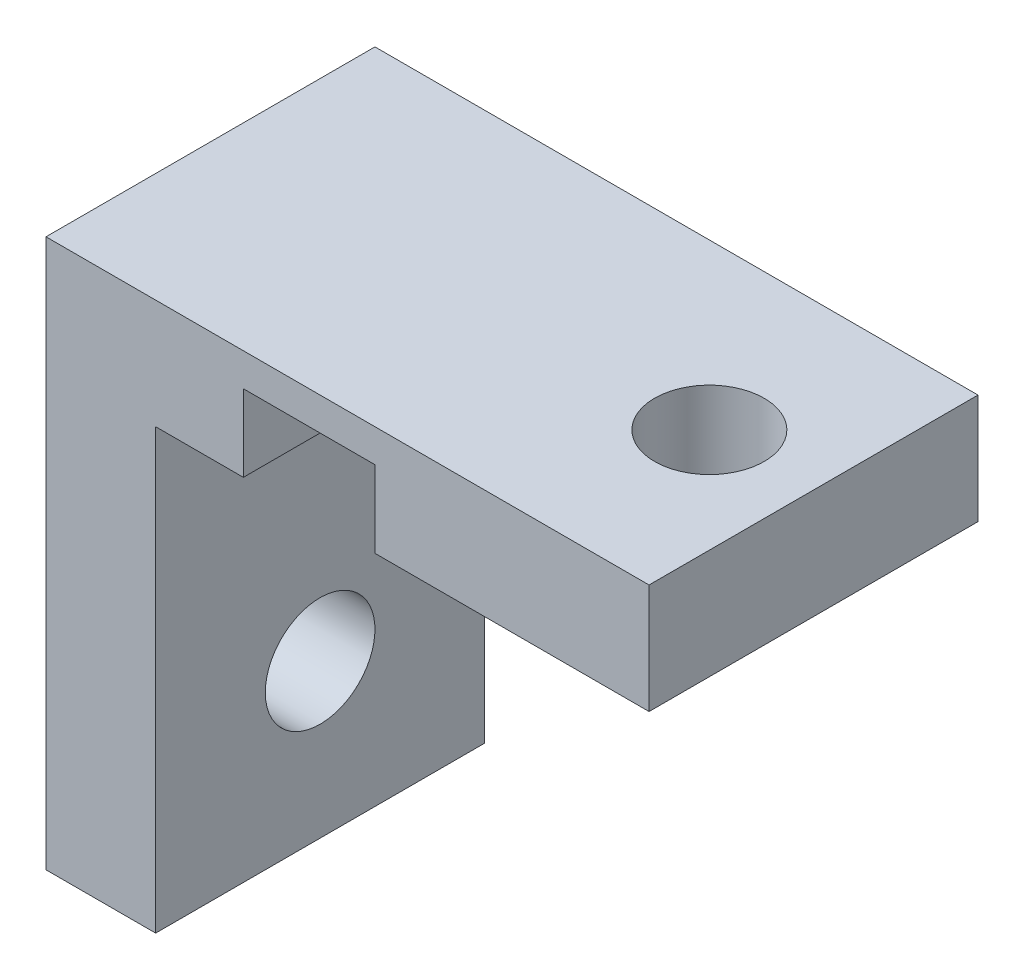
ISO-10303-21;
HEADER;
FILE_DESCRIPTION(('STEP AP214'),'2;1');
FILE_NAME('part.step','',(''),(''),'','','');
FILE_SCHEMA(('AUTOMOTIVE_DESIGN { 1 0 10303 214 1 1 1 1 }'));
ENDSEC;
DATA;
#1=APPLICATION_CONTEXT('core data for automotive mechanical design processes');
#2=APPLICATION_PROTOCOL_DEFINITION('international standard','automotive_design',2000,#1);
#3=PRODUCT_CONTEXT('',#1,'mechanical');
#4=PRODUCT('Part','Part','',(#3));
#5=PRODUCT_RELATED_PRODUCT_CATEGORY('part','',(#4));
#6=PRODUCT_DEFINITION_FORMATION('','',#4);
#7=PRODUCT_DEFINITION_CONTEXT('part definition',#1,'design');
#8=PRODUCT_DEFINITION('design','',#6,#7);
#9=PRODUCT_DEFINITION_SHAPE('','',#8);
#10=(LENGTH_UNIT() NAMED_UNIT(*) SI_UNIT(.MILLI.,.METRE.));
#11=(NAMED_UNIT(*) PLANE_ANGLE_UNIT() SI_UNIT($,.RADIAN.));
#12=(NAMED_UNIT(*) SI_UNIT($,.STERADIAN.) SOLID_ANGLE_UNIT());
#13=UNCERTAINTY_MEASURE_WITH_UNIT(LENGTH_MEASURE(1.E-05),#10,'distance_accuracy_value','');
#14=(GEOMETRIC_REPRESENTATION_CONTEXT(3) GLOBAL_UNCERTAINTY_ASSIGNED_CONTEXT((#13)) GLOBAL_UNIT_ASSIGNED_CONTEXT((#10,
#11,#12)) REPRESENTATION_CONTEXT('',''));
#15=CARTESIAN_POINT('',(0.,0.,0.));
#16=DIRECTION('',(0.,0.,1.));
#17=DIRECTION('',(1.,0.,0.));
#18=AXIS2_PLACEMENT_3D('',#15,#16,#17);
#19=CARTESIAN_POINT('',(6.25,-15.5,7.5));
#20=DIRECTION('',(-1.,0.,0.));
#21=DIRECTION('',(0.,0.,1.));
#22=AXIS2_PLACEMENT_3D('',#19,#20,#21);
#23=CYLINDRICAL_SURFACE('',#22,2.5);
#24=CARTESIAN_POINT('',(-8.75,-15.5,7.5));
#25=DIRECTION('',(-1.,0.,0.));
#26=DIRECTION('',(0.,0.,1.));
#27=AXIS2_PLACEMENT_3D('',#24,#25,#26);
#28=CIRCLE('',#27,2.5);
#29=CARTESIAN_POINT('',(-8.75,-15.5,10.));
#30=VERTEX_POINT('',#29);
#31=EDGE_CURVE('E20',#30,#30,#28,.T.);
#32=ORIENTED_EDGE('',*,*,#31,.F.);
#33=EDGE_LOOP('',(#32));
#34=FACE_BOUND('',#33,.T.);
#35=CARTESIAN_POINT('',(-13.75,-15.5,7.5));
#36=DIRECTION('',(-1.,0.,0.));
#37=DIRECTION('',(0.,0.,1.));
#38=AXIS2_PLACEMENT_3D('',#35,#36,#37);
#39=CIRCLE('',#38,2.5);
#40=CARTESIAN_POINT('',(-13.75,-15.5,10.));
#41=VERTEX_POINT('',#40);
#42=EDGE_CURVE('E141',#41,#41,#39,.T.);
#43=ORIENTED_EDGE('',*,*,#42,.T.);
#44=EDGE_LOOP('',(#43));
#45=FACE_BOUND('',#44,.T.);
#46=ADVANCED_FACE('F17',(#34,#45),#23,.F.);
#47=CARTESIAN_POINT('',(-4.74999999999989,0.999999999999998,0.));
#48=DIRECTION('',(-1.,0.,0.));
#49=DIRECTION('',(0.,-1.,0.));
#50=AXIS2_PLACEMENT_3D('',#47,#48,#49);
#51=PLANE('',#50);
#52=DIRECTION('',(0.,0.,1.));
#53=VECTOR('',#52,1.);
#54=CARTESIAN_POINT('',(-4.74999999999989,0.999999999999998,0.));
#55=LINE('',#54,#53);
#56=CARTESIAN_POINT('',(-4.74999999999989,0.999999999999998,0.));
#57=VERTEX_POINT('',#56);
#58=CARTESIAN_POINT('',(-4.74999999999989,0.999999999999998,15.));
#59=VERTEX_POINT('',#58);
#60=EDGE_CURVE('E125',#57,#59,#55,.T.);
#61=ORIENTED_EDGE('',*,*,#60,.T.);
#62=DIRECTION('',(0.,1.,0.));
#63=VECTOR('',#62,1.);
#64=CARTESIAN_POINT('',(-4.74999999999989,0.,15.));
#65=LINE('',#64,#63);
#66=CARTESIAN_POINT('',(-4.74999999999989,-2.5,15.));
#67=VERTEX_POINT('',#66);
#68=EDGE_CURVE('E205',#59,#67,#65,.F.);
#69=ORIENTED_EDGE('',*,*,#68,.T.);
#70=DIRECTION('',(0.,0.,1.));
#71=VECTOR('',#70,1.);
#72=CARTESIAN_POINT('',(-4.74999999999989,-2.5,15.));
#73=LINE('',#72,#71);
#74=CARTESIAN_POINT('',(-4.74999999999989,-2.5,0.));
#75=VERTEX_POINT('',#74);
#76=EDGE_CURVE('E133',#67,#75,#73,.F.);
#77=ORIENTED_EDGE('',*,*,#76,.T.);
#78=DIRECTION('',(0.,1.,0.));
#79=VECTOR('',#78,1.);
#80=CARTESIAN_POINT('',(-4.74999999999989,0.,0.));
#81=LINE('',#80,#79);
#82=EDGE_CURVE('E206',#57,#75,#81,.F.);
#83=ORIENTED_EDGE('',*,*,#82,.F.);
#84=EDGE_LOOP('',(#61,#69,#77,#83));
#85=FACE_BOUND('',#84,.T.);
#86=ADVANCED_FACE('F194',(#85),#51,.F.);
#87=CARTESIAN_POINT('',(13.75,-2.5,15.));
#88=DIRECTION('',(0.,1.,0.));
#89=DIRECTION('',(-1.,0.,0.));
#90=AXIS2_PLACEMENT_3D('',#87,#88,#89);
#91=PLANE('',#90);
#92=ORIENTED_EDGE('',*,*,#76,.F.);
#93=DIRECTION('',(-1.,0.,0.));
#94=VECTOR('',#93,1.);
#95=CARTESIAN_POINT('',(0.,-2.5,15.));
#96=LINE('',#95,#94);
#97=CARTESIAN_POINT('',(-8.75,-2.5,15.));
#98=VERTEX_POINT('',#97);
#99=EDGE_CURVE('E143',#67,#98,#96,.T.);
#100=ORIENTED_EDGE('',*,*,#99,.T.);
#101=DIRECTION('',(0.,0.,1.));
#102=VECTOR('',#101,1.);
#103=CARTESIAN_POINT('',(-8.75,-2.5,0.));
#104=LINE('',#103,#102);
#105=CARTESIAN_POINT('',(-8.75,-2.5,0.));
#106=VERTEX_POINT('',#105);
#107=EDGE_CURVE('E91',#106,#98,#104,.T.);
#108=ORIENTED_EDGE('',*,*,#107,.F.);
#109=DIRECTION('',(-1.,0.,0.));
#110=VECTOR('',#109,1.);
#111=CARTESIAN_POINT('',(0.,-2.5,0.));
#112=LINE('',#111,#110);
#113=EDGE_CURVE('E245',#75,#106,#112,.T.);
#114=ORIENTED_EDGE('',*,*,#113,.F.);
#115=EDGE_LOOP('',(#92,#100,#108,#114));
#116=FACE_BOUND('',#115,.T.);
#117=ADVANCED_FACE('F192',(#116),#91,.F.);
#118=CARTESIAN_POINT('',(-8.75,-22.5,0.));
#119=DIRECTION('',(1.,0.,0.));
#120=DIRECTION('',(0.,1.,0.));
#121=AXIS2_PLACEMENT_3D('',#118,#119,#120);
#122=PLANE('',#121);
#123=DIRECTION('',(0.,1.,0.));
#124=VECTOR('',#123,1.);
#125=CARTESIAN_POINT('',(-8.75,0.,0.));
#126=LINE('',#125,#124);
#127=CARTESIAN_POINT('',(-8.75,-22.5,0.));
#128=VERTEX_POINT('',#127);
#129=EDGE_CURVE('E243',#106,#128,#126,.F.);
#130=ORIENTED_EDGE('',*,*,#129,.F.);
#131=ORIENTED_EDGE('',*,*,#107,.T.);
#132=DIRECTION('',(0.,1.,0.));
#133=VECTOR('',#132,1.);
#134=CARTESIAN_POINT('',(-8.75,0.,15.));
#135=LINE('',#134,#133);
#136=CARTESIAN_POINT('',(-8.75,-22.5,15.));
#137=VERTEX_POINT('',#136);
#138=EDGE_CURVE('E111',#98,#137,#135,.F.);
#139=ORIENTED_EDGE('',*,*,#138,.T.);
#140=DIRECTION('',(0.,0.,-1.));
#141=VECTOR('',#140,1.);
#142=CARTESIAN_POINT('',(-8.75,-22.5,0.));
#143=LINE('',#142,#141);
#144=EDGE_CURVE('E97',#128,#137,#143,.F.);
#145=ORIENTED_EDGE('',*,*,#144,.F.);
#146=EDGE_LOOP('',(#130,#131,#139,#145));
#147=FACE_BOUND('',#146,.T.);
#148=ORIENTED_EDGE('',*,*,#31,.T.);
#149=EDGE_LOOP('',(#148));
#150=FACE_BOUND('',#149,.T.);
#151=ADVANCED_FACE('F117',(#147,#150),#122,.T.);
#152=CARTESIAN_POINT('',(-13.75,-22.5,0.));
#153=DIRECTION('',(0.,-1.,0.));
#154=DIRECTION('',(0.,0.,-1.));
#155=AXIS2_PLACEMENT_3D('',#152,#153,#154);
#156=PLANE('',#155);
#157=DIRECTION('',(-1.,0.,0.));
#158=VECTOR('',#157,1.);
#159=CARTESIAN_POINT('',(0.,-22.5,0.));
#160=LINE('',#159,#158);
#161=CARTESIAN_POINT('',(-13.75,-22.5,0.));
#162=VERTEX_POINT('',#161);
#163=EDGE_CURVE('E103',#128,#162,#160,.T.);
#164=ORIENTED_EDGE('',*,*,#163,.F.);
#165=ORIENTED_EDGE('',*,*,#144,.T.);
#166=DIRECTION('',(-1.,0.,0.));
#167=VECTOR('',#166,1.);
#168=CARTESIAN_POINT('',(0.,-22.5,15.));
#169=LINE('',#168,#167);
#170=CARTESIAN_POINT('',(-13.75,-22.5,15.));
#171=VERTEX_POINT('',#170);
#172=EDGE_CURVE('E101',#137,#171,#169,.T.);
#173=ORIENTED_EDGE('',*,*,#172,.T.);
#174=DIRECTION('',(0.,0.,-1.));
#175=VECTOR('',#174,1.);
#176=CARTESIAN_POINT('',(-13.75,-22.5,15.));
#177=LINE('',#176,#175);
#178=EDGE_CURVE('E248',#171,#162,#177,.T.);
#179=ORIENTED_EDGE('',*,*,#178,.T.);
#180=EDGE_LOOP('',(#164,#165,#173,#179));
#181=FACE_BOUND('',#180,.T.);
#182=ADVANCED_FACE('F99',(#181),#156,.T.);
#183=CARTESIAN_POINT('',(13.75,-2.5,15.));
#184=DIRECTION('',(0.,1.,0.));
#185=DIRECTION('',(-1.,0.,0.));
#186=AXIS2_PLACEMENT_3D('',#183,#184,#185);
#187=PLANE('',#186);
#188=DIRECTION('',(0.,0.,1.));
#189=VECTOR('',#188,1.);
#190=CARTESIAN_POINT('',(1.25000000000011,-2.5,0.));
#191=LINE('',#190,#189);
#192=CARTESIAN_POINT('',(1.25000000000011,-2.5,15.));
#193=VERTEX_POINT('',#192);
#194=CARTESIAN_POINT('',(1.25000000000011,-2.5,0.));
#195=VERTEX_POINT('',#194);
#196=EDGE_CURVE('E104',#193,#195,#191,.F.);
#197=ORIENTED_EDGE('',*,*,#196,.T.);
#198=DIRECTION('',(-1.,0.,0.));
#199=VECTOR('',#198,1.);
#200=CARTESIAN_POINT('',(0.,-2.5,0.));
#201=LINE('',#200,#199);
#202=CARTESIAN_POINT('',(13.75,-2.5,0.));
#203=VERTEX_POINT('',#202);
#204=EDGE_CURVE('E237',#203,#195,#201,.T.);
#205=ORIENTED_EDGE('',*,*,#204,.F.);
#206=DIRECTION('',(0.,0.,1.));
#207=VECTOR('',#206,1.);
#208=CARTESIAN_POINT('',(13.75,-2.5,15.));
#209=LINE('',#208,#207);
#210=CARTESIAN_POINT('',(13.75,-2.5,15.));
#211=VERTEX_POINT('',#210);
#212=EDGE_CURVE('E119',#203,#211,#209,.T.);
#213=ORIENTED_EDGE('',*,*,#212,.T.);
#214=DIRECTION('',(-1.,0.,0.));
#215=VECTOR('',#214,1.);
#216=CARTESIAN_POINT('',(0.,-2.5,15.));
#217=LINE('',#216,#215);
#218=EDGE_CURVE('E217',#211,#193,#217,.T.);
#219=ORIENTED_EDGE('',*,*,#218,.T.);
#220=EDGE_LOOP('',(#197,#205,#213,#219));
#221=FACE_BOUND('',#220,.T.);
#222=CARTESIAN_POINT('',(9.,-2.5,7.5));
#223=DIRECTION('',(0.,1.,0.));
#224=DIRECTION('',(-1.,0.,0.));
#225=AXIS2_PLACEMENT_3D('',#222,#223,#224);
#226=CIRCLE('',#225,2.5);
#227=CARTESIAN_POINT('',(6.5,-2.5,7.5));
#228=VERTEX_POINT('',#227);
#229=EDGE_CURVE('E121',#228,#228,#226,.T.);
#230=ORIENTED_EDGE('',*,*,#229,.T.);
#231=EDGE_LOOP('',(#230));
#232=FACE_BOUND('',#231,.T.);
#233=ADVANCED_FACE('F147',(#221,#232),#187,.F.);
#234=CARTESIAN_POINT('',(1.25000000000011,0.999999999999999,0.));
#235=DIRECTION('',(1.,0.,0.));
#236=DIRECTION('',(0.,1.,0.));
#237=AXIS2_PLACEMENT_3D('',#234,#235,#236);
#238=PLANE('',#237);
#239=DIRECTION('',(0.,0.,1.));
#240=VECTOR('',#239,1.);
#241=CARTESIAN_POINT('',(1.25000000000011,0.999999999999999,0.));
#242=LINE('',#241,#240);
#243=CARTESIAN_POINT('',(1.25000000000011,0.999999999999999,15.));
#244=VERTEX_POINT('',#243);
#245=CARTESIAN_POINT('',(1.25000000000011,0.999999999999999,0.));
#246=VERTEX_POINT('',#245);
#247=EDGE_CURVE('E127',#244,#246,#242,.F.);
#248=ORIENTED_EDGE('',*,*,#247,.T.);
#249=DIRECTION('',(0.,1.,0.));
#250=VECTOR('',#249,1.);
#251=CARTESIAN_POINT('',(1.25000000000011,0.,0.));
#252=LINE('',#251,#250);
#253=EDGE_CURVE('E235',#195,#246,#252,.T.);
#254=ORIENTED_EDGE('',*,*,#253,.F.);
#255=ORIENTED_EDGE('',*,*,#196,.F.);
#256=DIRECTION('',(0.,1.,0.));
#257=VECTOR('',#256,1.);
#258=CARTESIAN_POINT('',(1.25000000000011,0.,15.));
#259=LINE('',#258,#257);
#260=EDGE_CURVE('E215',#193,#244,#259,.T.);
#261=ORIENTED_EDGE('',*,*,#260,.T.);
#262=EDGE_LOOP('',(#248,#254,#255,#261));
#263=FACE_BOUND('',#262,.T.);
#264=ADVANCED_FACE('F180',(#263),#238,.F.);
#265=CARTESIAN_POINT('',(1.25000000000011,0.999999999999999,0.));
#266=DIRECTION('',(0.,1.,0.));
#267=DIRECTION('',(-1.,0.,0.));
#268=AXIS2_PLACEMENT_3D('',#265,#266,#267);
#269=PLANE('',#268);
#270=DIRECTION('',(-1.,0.,0.));
#271=VECTOR('',#270,1.);
#272=CARTESIAN_POINT('',(0.,0.999999999999999,0.));
#273=LINE('',#272,#271);
#274=EDGE_CURVE('E140',#246,#57,#273,.T.);
#275=ORIENTED_EDGE('',*,*,#274,.F.);
#276=ORIENTED_EDGE('',*,*,#247,.F.);
#277=DIRECTION('',(-1.,0.,0.));
#278=VECTOR('',#277,1.);
#279=CARTESIAN_POINT('',(0.,0.999999999999999,15.));
#280=LINE('',#279,#278);
#281=EDGE_CURVE('E212',#244,#59,#280,.T.);
#282=ORIENTED_EDGE('',*,*,#281,.T.);
#283=ORIENTED_EDGE('',*,*,#60,.F.);
#284=EDGE_LOOP('',(#275,#276,#282,#283));
#285=FACE_BOUND('',#284,.T.);
#286=ADVANCED_FACE('F153',(#285),#269,.F.);
#287=CARTESIAN_POINT('',(9.00000000000001,-17.5,7.5));
#288=DIRECTION('',(0.,1.,0.));
#289=DIRECTION('',(-1.,0.,0.));
#290=AXIS2_PLACEMENT_3D('',#287,#288,#289);
#291=CYLINDRICAL_SURFACE('',#290,2.5);
#292=ORIENTED_EDGE('',*,*,#229,.F.);
#293=EDGE_LOOP('',(#292));
#294=FACE_BOUND('',#293,.T.);
#295=CARTESIAN_POINT('',(9.,2.5,7.5));
#296=DIRECTION('',(0.,1.,0.));
#297=DIRECTION('',(-1.,0.,0.));
#298=AXIS2_PLACEMENT_3D('',#295,#296,#297);
#299=CIRCLE('',#298,2.5);
#300=CARTESIAN_POINT('',(6.5,2.5,7.5));
#301=VERTEX_POINT('',#300);
#302=EDGE_CURVE('E136',#301,#301,#299,.T.);
#303=ORIENTED_EDGE('',*,*,#302,.T.);
#304=EDGE_LOOP('',(#303));
#305=FACE_BOUND('',#304,.T.);
#306=ADVANCED_FACE('F149',(#294,#305),#291,.F.);
#307=CARTESIAN_POINT('',(13.75,2.5,15.));
#308=DIRECTION('',(-1.,0.,0.));
#309=DIRECTION('',(0.,0.,1.));
#310=AXIS2_PLACEMENT_3D('',#307,#308,#309);
#311=PLANE('',#310);
#312=DIRECTION('',(0.,0.,1.));
#313=VECTOR('',#312,1.);
#314=CARTESIAN_POINT('',(13.75,2.5,15.));
#315=LINE('',#314,#313);
#316=CARTESIAN_POINT('',(13.75,2.5,0.));
#317=VERTEX_POINT('',#316);
#318=CARTESIAN_POINT('',(13.75,2.5,15.));
#319=VERTEX_POINT('',#318);
#320=EDGE_CURVE('E139',#317,#319,#315,.T.);
#321=ORIENTED_EDGE('',*,*,#320,.T.);
#322=DIRECTION('',(0.,1.,0.));
#323=VECTOR('',#322,1.);
#324=CARTESIAN_POINT('',(13.75,0.,15.));
#325=LINE('',#324,#323);
#326=EDGE_CURVE('E115',#319,#211,#325,.F.);
#327=ORIENTED_EDGE('',*,*,#326,.T.);
#328=ORIENTED_EDGE('',*,*,#212,.F.);
#329=DIRECTION('',(0.,1.,0.));
#330=VECTOR('',#329,1.);
#331=CARTESIAN_POINT('',(13.75,0.,0.));
#332=LINE('',#331,#330);
#333=EDGE_CURVE('E239',#317,#203,#332,.F.);
#334=ORIENTED_EDGE('',*,*,#333,.F.);
#335=EDGE_LOOP('',(#321,#327,#328,#334));
#336=FACE_BOUND('',#335,.T.);
#337=ADVANCED_FACE('F152',(#336),#311,.F.);
#338=CARTESIAN_POINT('',(0.,0.,15.));
#339=DIRECTION('',(0.,0.,-1.));
#340=DIRECTION('',(-1.,0.,0.));
#341=AXIS2_PLACEMENT_3D('',#338,#339,#340);
#342=PLANE('',#341);
#343=ORIENTED_EDGE('',*,*,#68,.F.);
#344=ORIENTED_EDGE('',*,*,#281,.F.);
#345=ORIENTED_EDGE('',*,*,#260,.F.);
#346=ORIENTED_EDGE('',*,*,#218,.F.);
#347=ORIENTED_EDGE('',*,*,#326,.F.);
#348=DIRECTION('',(1.,0.,0.));
#349=VECTOR('',#348,1.);
#350=CARTESIAN_POINT('',(13.75,2.5,15.));
#351=LINE('',#350,#349);
#352=CARTESIAN_POINT('',(-13.75,2.5,15.));
#353=VERTEX_POINT('',#352);
#354=EDGE_CURVE('E228',#319,#353,#351,.F.);
#355=ORIENTED_EDGE('',*,*,#354,.T.);
#356=DIRECTION('',(0.,1.,0.));
#357=VECTOR('',#356,1.);
#358=CARTESIAN_POINT('',(-13.75,2.5,15.));
#359=LINE('',#358,#357);
#360=EDGE_CURVE('E114',#353,#171,#359,.F.);
#361=ORIENTED_EDGE('',*,*,#360,.T.);
#362=ORIENTED_EDGE('',*,*,#172,.F.);
#363=ORIENTED_EDGE('',*,*,#138,.F.);
#364=ORIENTED_EDGE('',*,*,#99,.F.);
#365=EDGE_LOOP('',(#343,#344,#345,#346,#347,#355,#361,#362,#363,#364));
#366=FACE_BOUND('',#365,.T.);
#367=ADVANCED_FACE('F109',(#366),#342,.F.);
#368=CARTESIAN_POINT('',(-13.75,2.5,15.));
#369=DIRECTION('',(1.,0.,0.));
#370=DIRECTION('',(0.,0.,-1.));
#371=AXIS2_PLACEMENT_3D('',#368,#369,#370);
#372=PLANE('',#371);
#373=ORIENTED_EDGE('',*,*,#178,.F.);
#374=ORIENTED_EDGE('',*,*,#360,.F.);
#375=DIRECTION('',(0.,0.,1.));
#376=VECTOR('',#375,1.);
#377=CARTESIAN_POINT('',(-13.75,2.5,15.));
#378=LINE('',#377,#376);
#379=CARTESIAN_POINT('',(-13.75,2.5,0.));
#380=VERTEX_POINT('',#379);
#381=EDGE_CURVE('E26',#353,#380,#378,.F.);
#382=ORIENTED_EDGE('',*,*,#381,.T.);
#383=DIRECTION('',(0.,1.,0.));
#384=VECTOR('',#383,1.);
#385=CARTESIAN_POINT('',(-13.75,0.,0.));
#386=LINE('',#385,#384);
#387=EDGE_CURVE('E34',#162,#380,#386,.T.);
#388=ORIENTED_EDGE('',*,*,#387,.F.);
#389=EDGE_LOOP('',(#373,#374,#382,#388));
#390=FACE_BOUND('',#389,.T.);
#391=ORIENTED_EDGE('',*,*,#42,.F.);
#392=EDGE_LOOP('',(#391));
#393=FACE_BOUND('',#392,.T.);
#394=ADVANCED_FACE('F166',(#390,#393),#372,.F.);
#395=CARTESIAN_POINT('',(0.,0.,0.));
#396=DIRECTION('',(0.,0.,-1.));
#397=DIRECTION('',(-1.,0.,0.));
#398=AXIS2_PLACEMENT_3D('',#395,#396,#397);
#399=PLANE('',#398);
#400=ORIENTED_EDGE('',*,*,#253,.T.);
#401=ORIENTED_EDGE('',*,*,#274,.T.);
#402=ORIENTED_EDGE('',*,*,#82,.T.);
#403=ORIENTED_EDGE('',*,*,#113,.T.);
#404=ORIENTED_EDGE('',*,*,#129,.T.);
#405=ORIENTED_EDGE('',*,*,#163,.T.);
#406=ORIENTED_EDGE('',*,*,#387,.T.);
#407=DIRECTION('',(1.,0.,0.));
#408=VECTOR('',#407,1.);
#409=CARTESIAN_POINT('',(13.75,2.5,0.));
#410=LINE('',#409,#408);
#411=EDGE_CURVE('E11',#380,#317,#410,.T.);
#412=ORIENTED_EDGE('',*,*,#411,.T.);
#413=ORIENTED_EDGE('',*,*,#333,.T.);
#414=ORIENTED_EDGE('',*,*,#204,.T.);
#415=EDGE_LOOP('',(#400,#401,#402,#403,#404,#405,#406,#412,#413,#414));
#416=FACE_BOUND('',#415,.T.);
#417=ADVANCED_FACE('F159',(#416),#399,.T.);
#418=CARTESIAN_POINT('',(13.75,2.5,15.));
#419=DIRECTION('',(0.,-1.,0.));
#420=DIRECTION('',(1.,0.,0.));
#421=AXIS2_PLACEMENT_3D('',#418,#419,#420);
#422=PLANE('',#421);
#423=ORIENTED_EDGE('',*,*,#381,.F.);
#424=ORIENTED_EDGE('',*,*,#354,.F.);
#425=ORIENTED_EDGE('',*,*,#320,.F.);
#426=ORIENTED_EDGE('',*,*,#411,.F.);
#427=EDGE_LOOP('',(#423,#424,#425,#426));
#428=FACE_BOUND('',#427,.T.);
#429=ORIENTED_EDGE('',*,*,#302,.F.);
#430=EDGE_LOOP('',(#429));
#431=FACE_BOUND('',#430,.T.);
#432=ADVANCED_FACE('F157',(#428,#431),#422,.F.);
#433=CLOSED_SHELL('',(#46,#86,#117,#151,#182,#233,#264,#286,#306,#337,#367,#394,#417,#432));
#434=MANIFOLD_SOLID_BREP('B1',#433);
#435=ADVANCED_BREP_SHAPE_REPRESENTATION('',(#18,#434),#14);
#436=SHAPE_DEFINITION_REPRESENTATION(#9,#435);
ENDSEC;
END-ISO-10303-21;
